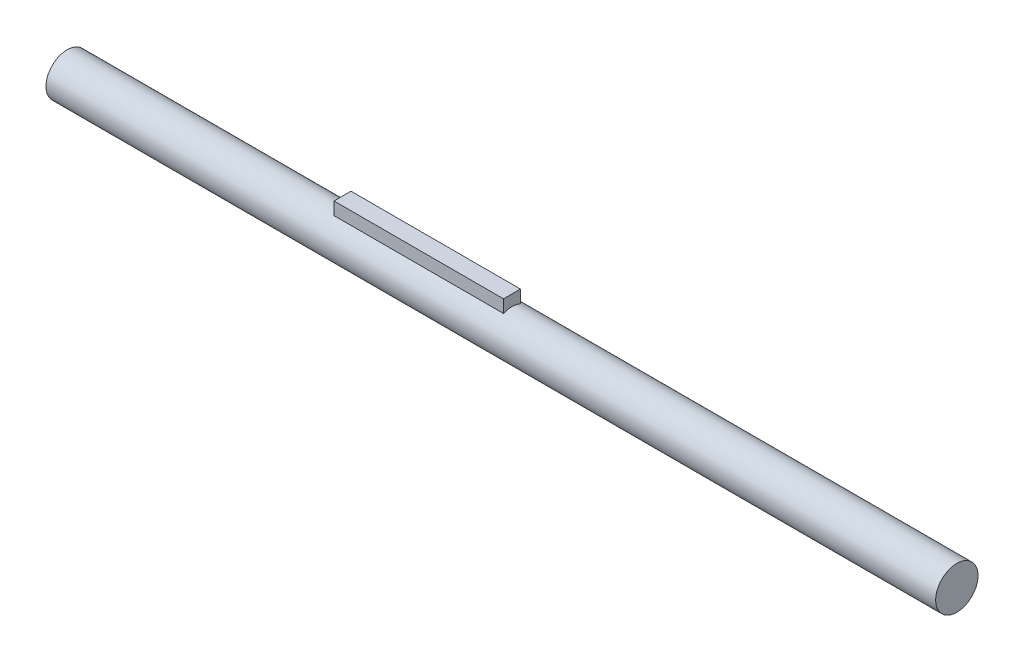
ISO-10303-21;
HEADER;
FILE_DESCRIPTION(('STEP AP214'),'2;1');
FILE_NAME('part.step','',(''),(''),'','','');
FILE_SCHEMA(('AUTOMOTIVE_DESIGN { 1 0 10303 214 1 1 1 1 }'));
ENDSEC;
DATA;
#1=APPLICATION_CONTEXT('core data for automotive mechanical design processes');
#2=APPLICATION_PROTOCOL_DEFINITION('international standard','automotive_design',2000,#1);
#3=PRODUCT_CONTEXT('',#1,'mechanical');
#4=PRODUCT('Part','Part','',(#3));
#5=PRODUCT_RELATED_PRODUCT_CATEGORY('part','',(#4));
#6=PRODUCT_DEFINITION_FORMATION('','',#4);
#7=PRODUCT_DEFINITION_CONTEXT('part definition',#1,'design');
#8=PRODUCT_DEFINITION('design','',#6,#7);
#9=PRODUCT_DEFINITION_SHAPE('','',#8);
#10=(LENGTH_UNIT() NAMED_UNIT(*) SI_UNIT(.MILLI.,.METRE.));
#11=(NAMED_UNIT(*) PLANE_ANGLE_UNIT() SI_UNIT($,.RADIAN.));
#12=(NAMED_UNIT(*) SI_UNIT($,.STERADIAN.) SOLID_ANGLE_UNIT());
#13=UNCERTAINTY_MEASURE_WITH_UNIT(LENGTH_MEASURE(1.E-05),#10,'distance_accuracy_value','');
#14=(GEOMETRIC_REPRESENTATION_CONTEXT(3) GLOBAL_UNCERTAINTY_ASSIGNED_CONTEXT((#13)) GLOBAL_UNIT_ASSIGNED_CONTEXT((#10,
#11,#12)) REPRESENTATION_CONTEXT('',''));
#15=CARTESIAN_POINT('',(0.,0.,0.));
#16=DIRECTION('',(0.,0.,1.));
#17=DIRECTION('',(1.,0.,0.));
#18=AXIS2_PLACEMENT_3D('',#15,#16,#17);
#19=CARTESIAN_POINT('',(1050.,0.,0.));
#20=DIRECTION('',(-1.,0.,0.));
#21=DIRECTION('',(0.,0.,1.));
#22=AXIS2_PLACEMENT_3D('',#19,#20,#21);
#23=CYLINDRICAL_SURFACE('',#22,25.);
#24=CARTESIAN_POINT('',(0.,0.,0.));
#25=DIRECTION('',(1.,0.,0.));
#26=DIRECTION('',(0.,0.,-1.));
#27=AXIS2_PLACEMENT_3D('',#24,#25,#26);
#28=CIRCLE('',#27,25.);
#29=CARTESIAN_POINT('',(0.,0.,-25.));
#30=VERTEX_POINT('',#29);
#31=EDGE_CURVE('E122',#30,#30,#28,.T.);
#32=ORIENTED_EDGE('',*,*,#31,.T.);
#33=EDGE_LOOP('',(#32));
#34=FACE_BOUND('',#33,.T.);
#35=CARTESIAN_POINT('',(1050.,0.,0.));
#36=DIRECTION('',(1.,0.,0.));
#37=DIRECTION('',(0.,0.,-1.));
#38=AXIS2_PLACEMENT_3D('',#35,#36,#37);
#39=CIRCLE('',#38,25.);
#40=CARTESIAN_POINT('',(1050.,0.,-25.));
#41=VERTEX_POINT('',#40);
#42=EDGE_CURVE('E127',#41,#41,#39,.T.);
#43=ORIENTED_EDGE('',*,*,#42,.F.);
#44=EDGE_LOOP('',(#43));
#45=FACE_BOUND('',#44,.T.);
#46=CARTESIAN_POINT('',(525.,0.,0.));
#47=DIRECTION('',(-1.,0.,0.));
#48=DIRECTION('',(0.,0.,1.));
#49=AXIS2_PLACEMENT_3D('',#46,#47,#48);
#50=CIRCLE('',#49,25.);
#51=CARTESIAN_POINT('',(525.,22.9128784747792,10.));
#52=VERTEX_POINT('',#51);
#53=CARTESIAN_POINT('',(525.,22.9128784747792,-10.));
#54=VERTEX_POINT('',#53);
#55=EDGE_CURVE('E11',#52,#54,#50,.T.);
#56=ORIENTED_EDGE('',*,*,#55,.F.);
#57=DIRECTION('',(-1.,0.,0.));
#58=VECTOR('',#57,1.);
#59=CARTESIAN_POINT('',(525.,22.9128784747792,10.));
#60=LINE('',#59,#58);
#61=CARTESIAN_POINT('',(325.,22.9128784747792,10.));
#62=VERTEX_POINT('',#61);
#63=EDGE_CURVE('E66',#52,#62,#60,.T.);
#64=ORIENTED_EDGE('',*,*,#63,.T.);
#65=CARTESIAN_POINT('',(325.,0.,0.));
#66=DIRECTION('',(-1.,0.,0.));
#67=DIRECTION('',(0.,0.,1.));
#68=AXIS2_PLACEMENT_3D('',#65,#66,#67);
#69=CIRCLE('',#68,25.);
#70=CARTESIAN_POINT('',(325.,22.9128784747792,-10.));
#71=VERTEX_POINT('',#70);
#72=EDGE_CURVE('E50',#62,#71,#69,.T.);
#73=ORIENTED_EDGE('',*,*,#72,.T.);
#74=DIRECTION('',(-1.,0.,0.));
#75=VECTOR('',#74,1.);
#76=CARTESIAN_POINT('',(525.,22.9128784747792,-10.));
#77=LINE('',#76,#75);
#78=EDGE_CURVE('E97',#54,#71,#77,.T.);
#79=ORIENTED_EDGE('',*,*,#78,.F.);
#80=EDGE_LOOP('',(#56,#64,#73,#79));
#81=FACE_BOUND('',#80,.T.);
#82=ADVANCED_FACE('F42',(#34,#45,#81),#23,.T.);
#83=CARTESIAN_POINT('',(1050.,0.,0.));
#84=DIRECTION('',(1.,0.,0.));
#85=DIRECTION('',(0.,0.,-1.));
#86=AXIS2_PLACEMENT_3D('',#83,#84,#85);
#87=PLANE('',#86);
#88=ORIENTED_EDGE('',*,*,#42,.T.);
#89=EDGE_LOOP('',(#88));
#90=FACE_BOUND('',#89,.T.);
#91=ADVANCED_FACE('F136',(#90),#87,.T.);
#92=CARTESIAN_POINT('',(0.,0.,0.));
#93=DIRECTION('',(1.,0.,0.));
#94=DIRECTION('',(0.,0.,-1.));
#95=AXIS2_PLACEMENT_3D('',#92,#93,#94);
#96=PLANE('',#95);
#97=ORIENTED_EDGE('',*,*,#31,.F.);
#98=EDGE_LOOP('',(#97));
#99=FACE_BOUND('',#98,.T.);
#100=ADVANCED_FACE('F143',(#99),#96,.F.);
#101=CARTESIAN_POINT('',(525.,37.9128784747792,10.));
#102=DIRECTION('',(0.,0.,1.));
#103=DIRECTION('',(1.,0.,0.));
#104=AXIS2_PLACEMENT_3D('',#101,#102,#103);
#105=PLANE('',#104);
#106=DIRECTION('',(0.,1.,0.));
#107=VECTOR('',#106,1.);
#108=CARTESIAN_POINT('',(325.,37.9128784747792,10.));
#109=LINE('',#108,#107);
#110=CARTESIAN_POINT('',(325.,37.9128784747792,10.));
#111=VERTEX_POINT('',#110);
#112=EDGE_CURVE('E112',#62,#111,#109,.T.);
#113=ORIENTED_EDGE('',*,*,#112,.F.);
#114=ORIENTED_EDGE('',*,*,#63,.F.);
#115=DIRECTION('',(0.,1.,0.));
#116=VECTOR('',#115,1.);
#117=CARTESIAN_POINT('',(525.,37.9128784747792,10.));
#118=LINE('',#117,#116);
#119=CARTESIAN_POINT('',(525.,37.9128784747792,10.));
#120=VERTEX_POINT('',#119);
#121=EDGE_CURVE('E107',#52,#120,#118,.T.);
#122=ORIENTED_EDGE('',*,*,#121,.T.);
#123=DIRECTION('',(-1.,0.,0.));
#124=VECTOR('',#123,1.);
#125=CARTESIAN_POINT('',(525.,37.9128784747792,10.));
#126=LINE('',#125,#124);
#127=EDGE_CURVE('E86',#120,#111,#126,.T.);
#128=ORIENTED_EDGE('',*,*,#127,.T.);
#129=EDGE_LOOP('',(#113,#114,#122,#128));
#130=FACE_BOUND('',#129,.T.);
#131=ADVANCED_FACE('F150',(#130),#105,.T.);
#132=CARTESIAN_POINT('',(525.,22.9128784747792,-10.));
#133=DIRECTION('',(0.,0.,-1.));
#134=DIRECTION('',(-1.,0.,0.));
#135=AXIS2_PLACEMENT_3D('',#132,#133,#134);
#136=PLANE('',#135);
#137=DIRECTION('',(0.,-1.,0.));
#138=VECTOR('',#137,1.);
#139=CARTESIAN_POINT('',(325.,22.9128784747792,-10.));
#140=LINE('',#139,#138);
#141=CARTESIAN_POINT('',(325.,37.9128784747792,-10.));
#142=VERTEX_POINT('',#141);
#143=EDGE_CURVE('E57',#142,#71,#140,.T.);
#144=ORIENTED_EDGE('',*,*,#143,.F.);
#145=DIRECTION('',(-1.,0.,0.));
#146=VECTOR('',#145,1.);
#147=CARTESIAN_POINT('',(525.,37.9128784747792,-10.));
#148=LINE('',#147,#146);
#149=CARTESIAN_POINT('',(525.,37.9128784747792,-10.));
#150=VERTEX_POINT('',#149);
#151=EDGE_CURVE('E91',#150,#142,#148,.T.);
#152=ORIENTED_EDGE('',*,*,#151,.F.);
#153=DIRECTION('',(0.,-1.,0.));
#154=VECTOR('',#153,1.);
#155=CARTESIAN_POINT('',(525.,22.9128784747792,-10.));
#156=LINE('',#155,#154);
#157=EDGE_CURVE('E94',#150,#54,#156,.T.);
#158=ORIENTED_EDGE('',*,*,#157,.T.);
#159=ORIENTED_EDGE('',*,*,#78,.T.);
#160=EDGE_LOOP('',(#144,#152,#158,#159));
#161=FACE_BOUND('',#160,.T.);
#162=ADVANCED_FACE('F93',(#161),#136,.T.);
#163=CARTESIAN_POINT('',(525.,37.9128784747792,-10.));
#164=DIRECTION('',(0.,1.,0.));
#165=DIRECTION('',(0.,0.,1.));
#166=AXIS2_PLACEMENT_3D('',#163,#164,#165);
#167=PLANE('',#166);
#168=DIRECTION('',(0.,0.,-1.));
#169=VECTOR('',#168,1.);
#170=CARTESIAN_POINT('',(325.,37.9128784747792,-10.));
#171=LINE('',#170,#169);
#172=EDGE_CURVE('E115',#111,#142,#171,.T.);
#173=ORIENTED_EDGE('',*,*,#172,.F.);
#174=ORIENTED_EDGE('',*,*,#127,.F.);
#175=DIRECTION('',(0.,0.,-1.));
#176=VECTOR('',#175,1.);
#177=CARTESIAN_POINT('',(525.,37.9128784747792,-10.));
#178=LINE('',#177,#176);
#179=EDGE_CURVE('E101',#120,#150,#178,.T.);
#180=ORIENTED_EDGE('',*,*,#179,.T.);
#181=ORIENTED_EDGE('',*,*,#151,.T.);
#182=EDGE_LOOP('',(#173,#174,#180,#181));
#183=FACE_BOUND('',#182,.T.);
#184=ADVANCED_FACE('F105',(#183),#167,.T.);
#185=CARTESIAN_POINT('',(525.,0.,0.));
#186=DIRECTION('',(-1.,0.,0.));
#187=DIRECTION('',(0.,0.,1.));
#188=AXIS2_PLACEMENT_3D('',#185,#186,#187);
#189=PLANE('',#188);
#190=ORIENTED_EDGE('',*,*,#121,.F.);
#191=ORIENTED_EDGE('',*,*,#55,.T.);
#192=ORIENTED_EDGE('',*,*,#157,.F.);
#193=ORIENTED_EDGE('',*,*,#179,.F.);
#194=EDGE_LOOP('',(#190,#191,#192,#193));
#195=FACE_BOUND('',#194,.T.);
#196=ADVANCED_FACE('F100',(#195),#189,.F.);
#197=CARTESIAN_POINT('',(325.,0.,0.));
#198=DIRECTION('',(-1.,0.,0.));
#199=DIRECTION('',(0.,0.,1.));
#200=AXIS2_PLACEMENT_3D('',#197,#198,#199);
#201=PLANE('',#200);
#202=ORIENTED_EDGE('',*,*,#72,.F.);
#203=ORIENTED_EDGE('',*,*,#112,.T.);
#204=ORIENTED_EDGE('',*,*,#172,.T.);
#205=ORIENTED_EDGE('',*,*,#143,.T.);
#206=EDGE_LOOP('',(#202,#203,#204,#205));
#207=FACE_BOUND('',#206,.T.);
#208=ADVANCED_FACE('F159',(#207),#201,.T.);
#209=CLOSED_SHELL('',(#82,#91,#100,#131,#162,#184,#196,#208));
#210=MANIFOLD_SOLID_BREP('B2',#209);
#211=ADVANCED_BREP_SHAPE_REPRESENTATION('',(#18,#210),#14);
#212=SHAPE_DEFINITION_REPRESENTATION(#9,#211);
ENDSEC;
END-ISO-10303-21;
